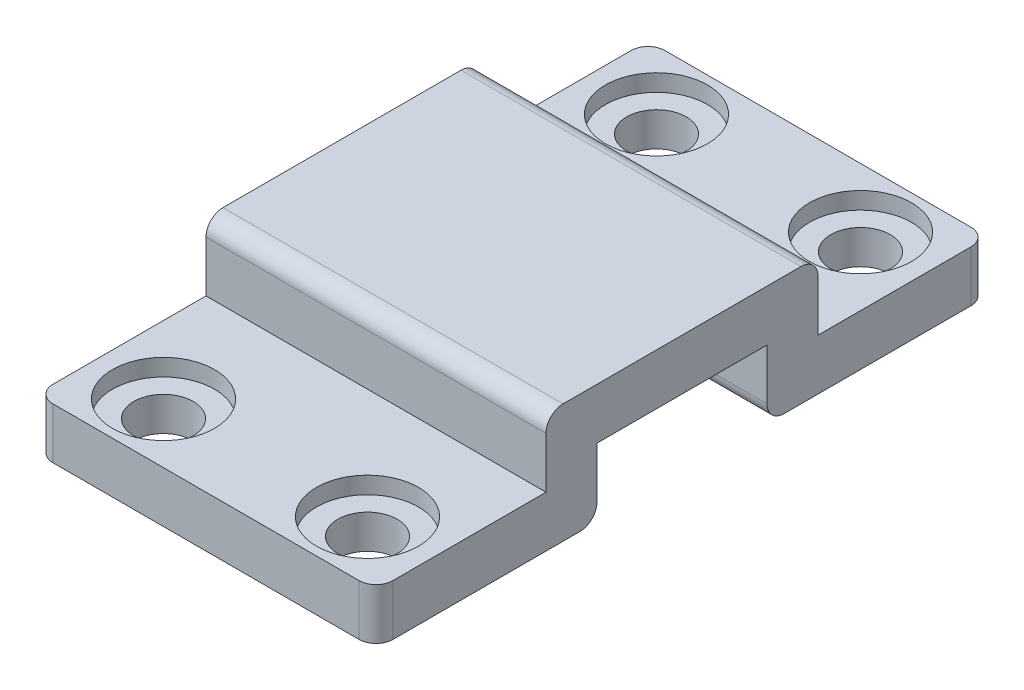
ISO-10303-21;
HEADER;
FILE_DESCRIPTION(('STEP AP214'),'2;1');
FILE_NAME('part.step','',(''),(''),'','','');
FILE_SCHEMA(('AUTOMOTIVE_DESIGN { 1 0 10303 214 1 1 1 1 }'));
ENDSEC;
DATA;
#1=APPLICATION_CONTEXT('core data for automotive mechanical design processes');
#2=APPLICATION_PROTOCOL_DEFINITION('international standard','automotive_design',2000,#1);
#3=PRODUCT_CONTEXT('',#1,'mechanical');
#4=PRODUCT('Part','Part','',(#3));
#5=PRODUCT_RELATED_PRODUCT_CATEGORY('part','',(#4));
#6=PRODUCT_DEFINITION_FORMATION('','',#4);
#7=PRODUCT_DEFINITION_CONTEXT('part definition',#1,'design');
#8=PRODUCT_DEFINITION('design','',#6,#7);
#9=PRODUCT_DEFINITION_SHAPE('','',#8);
#10=(LENGTH_UNIT() NAMED_UNIT(*) SI_UNIT(.MILLI.,.METRE.));
#11=(NAMED_UNIT(*) PLANE_ANGLE_UNIT() SI_UNIT($,.RADIAN.));
#12=(NAMED_UNIT(*) SI_UNIT($,.STERADIAN.) SOLID_ANGLE_UNIT());
#13=UNCERTAINTY_MEASURE_WITH_UNIT(LENGTH_MEASURE(1.E-05),#10,'distance_accuracy_value','');
#14=(GEOMETRIC_REPRESENTATION_CONTEXT(3) GLOBAL_UNCERTAINTY_ASSIGNED_CONTEXT((#13)) GLOBAL_UNIT_ASSIGNED_CONTEXT((#10,
#11,#12)) REPRESENTATION_CONTEXT('',''));
#15=CARTESIAN_POINT('',(0.,0.,0.));
#16=DIRECTION('',(0.,0.,1.));
#17=DIRECTION('',(1.,0.,0.));
#18=AXIS2_PLACEMENT_3D('',#15,#16,#17);
#19=CARTESIAN_POINT('',(6.00000000000001,-4.000025,14.5));
#20=DIRECTION('',(0.,1.,0.));
#21=DIRECTION('',(0.,0.,1.));
#22=AXIS2_PLACEMENT_3D('',#19,#20,#21);
#23=CYLINDRICAL_SURFACE('',#22,1.75);
#24=CARTESIAN_POINT('',(6.00000000000001,-4.,14.5));
#25=DIRECTION('',(0.,-1.,0.));
#26=DIRECTION('',(0.,0.,-1.));
#27=AXIS2_PLACEMENT_3D('',#24,#25,#26);
#28=CIRCLE('',#27,1.75);
#29=CARTESIAN_POINT('',(6.00000000000001,-4.,12.75));
#30=VERTEX_POINT('',#29);
#31=EDGE_CURVE('E668',#30,#30,#28,.T.);
#32=ORIENTED_EDGE('',*,*,#31,.T.);
#33=EDGE_LOOP('',(#32));
#34=FACE_BOUND('',#33,.T.);
#35=CARTESIAN_POINT('',(6.00000000000001,-2.,14.5));
#36=DIRECTION('',(0.,1.,0.));
#37=DIRECTION('',(0.,0.,1.));
#38=AXIS2_PLACEMENT_3D('',#35,#36,#37);
#39=CIRCLE('',#38,1.75);
#40=CARTESIAN_POINT('',(6.00000000000001,-2.,16.25));
#41=VERTEX_POINT('',#40);
#42=EDGE_CURVE('E703',#41,#41,#39,.T.);
#43=ORIENTED_EDGE('',*,*,#42,.T.);
#44=EDGE_LOOP('',(#43));
#45=FACE_BOUND('',#44,.T.);
#46=ADVANCED_FACE('F35',(#34,#45),#23,.F.);
#47=CARTESIAN_POINT('',(-6.,-4.000025,14.5));
#48=DIRECTION('',(0.,1.,0.));
#49=DIRECTION('',(0.,0.,1.));
#50=AXIS2_PLACEMENT_3D('',#47,#48,#49);
#51=CYLINDRICAL_SURFACE('',#50,1.75);
#52=CARTESIAN_POINT('',(-6.,-4.,14.5));
#53=DIRECTION('',(0.,-1.,0.));
#54=DIRECTION('',(0.,0.,-1.));
#55=AXIS2_PLACEMENT_3D('',#52,#53,#54);
#56=CIRCLE('',#55,1.75);
#57=CARTESIAN_POINT('',(-6.,-4.,12.75));
#58=VERTEX_POINT('',#57);
#59=EDGE_CURVE('E665',#58,#58,#56,.F.);
#60=ORIENTED_EDGE('',*,*,#59,.F.);
#61=EDGE_LOOP('',(#60));
#62=FACE_BOUND('',#61,.T.);
#63=CARTESIAN_POINT('',(-6.,-2.,14.5));
#64=DIRECTION('',(0.,1.,0.));
#65=DIRECTION('',(0.,0.,1.));
#66=AXIS2_PLACEMENT_3D('',#63,#64,#65);
#67=CIRCLE('',#66,1.75);
#68=CARTESIAN_POINT('',(-6.,-2.,16.25));
#69=VERTEX_POINT('',#68);
#70=EDGE_CURVE('E694',#69,#69,#67,.T.);
#71=ORIENTED_EDGE('',*,*,#70,.T.);
#72=EDGE_LOOP('',(#71));
#73=FACE_BOUND('',#72,.T.);
#74=ADVANCED_FACE('F427',(#62,#73),#51,.F.);
#75=CARTESIAN_POINT('',(6.,-4.000025,-14.5));
#76=DIRECTION('',(0.,1.,0.));
#77=DIRECTION('',(0.,0.,1.));
#78=AXIS2_PLACEMENT_3D('',#75,#76,#77);
#79=CYLINDRICAL_SURFACE('',#78,1.75);
#80=CARTESIAN_POINT('',(6.,-4.,-14.5));
#81=DIRECTION('',(0.,1.,0.));
#82=DIRECTION('',(0.,0.,1.));
#83=AXIS2_PLACEMENT_3D('',#80,#81,#82);
#84=CIRCLE('',#83,1.75);
#85=CARTESIAN_POINT('',(6.,-4.,-12.75));
#86=VERTEX_POINT('',#85);
#87=EDGE_CURVE('E209',#86,#86,#84,.F.);
#88=ORIENTED_EDGE('',*,*,#87,.T.);
#89=EDGE_LOOP('',(#88));
#90=FACE_BOUND('',#89,.T.);
#91=CARTESIAN_POINT('',(6.,-2.,-14.5));
#92=DIRECTION('',(0.,1.,0.));
#93=DIRECTION('',(0.,0.,1.));
#94=AXIS2_PLACEMENT_3D('',#91,#92,#93);
#95=CIRCLE('',#94,1.75);
#96=CARTESIAN_POINT('',(6.,-2.,-12.75));
#97=VERTEX_POINT('',#96);
#98=EDGE_CURVE('E685',#97,#97,#95,.F.);
#99=ORIENTED_EDGE('',*,*,#98,.F.);
#100=EDGE_LOOP('',(#99));
#101=FACE_BOUND('',#100,.T.);
#102=ADVANCED_FACE('F433',(#90,#101),#79,.F.);
#103=CARTESIAN_POINT('',(-6.,-4.000025,-14.5));
#104=DIRECTION('',(0.,1.,0.));
#105=DIRECTION('',(0.,0.,1.));
#106=AXIS2_PLACEMENT_3D('',#103,#104,#105);
#107=CYLINDRICAL_SURFACE('',#106,1.75);
#108=CARTESIAN_POINT('',(-6.,-4.,-14.5));
#109=DIRECTION('',(0.,1.,0.));
#110=DIRECTION('',(0.,0.,1.));
#111=AXIS2_PLACEMENT_3D('',#108,#109,#110);
#112=CIRCLE('',#111,1.75);
#113=CARTESIAN_POINT('',(-6.,-4.,-12.75));
#114=VERTEX_POINT('',#113);
#115=EDGE_CURVE('E204',#114,#114,#112,.T.);
#116=ORIENTED_EDGE('',*,*,#115,.F.);
#117=EDGE_LOOP('',(#116));
#118=FACE_BOUND('',#117,.T.);
#119=CARTESIAN_POINT('',(-6.,-2.,-14.5));
#120=DIRECTION('',(0.,1.,0.));
#121=DIRECTION('',(0.,0.,1.));
#122=AXIS2_PLACEMENT_3D('',#119,#120,#121);
#123=CIRCLE('',#122,1.75);
#124=CARTESIAN_POINT('',(-6.,-2.,-12.75));
#125=VERTEX_POINT('',#124);
#126=EDGE_CURVE('E676',#125,#125,#123,.F.);
#127=ORIENTED_EDGE('',*,*,#126,.F.);
#128=EDGE_LOOP('',(#127));
#129=FACE_BOUND('',#128,.T.);
#130=ADVANCED_FACE('F444',(#118,#129),#107,.F.);
#131=CARTESIAN_POINT('',(0.,-4.,0.));
#132=DIRECTION('',(0.,-1.,0.));
#133=DIRECTION('',(0.,0.,-1.));
#134=AXIS2_PLACEMENT_3D('',#131,#132,#133);
#135=PLANE('',#134);
#136=ORIENTED_EDGE('',*,*,#31,.F.);
#137=EDGE_LOOP('',(#136));
#138=FACE_BOUND('',#137,.T.);
#139=DIRECTION('',(0.,0.,-1.));
#140=VECTOR('',#139,1.);
#141=CARTESIAN_POINT('',(10.,-4.,8.));
#142=LINE('',#141,#140);
#143=CARTESIAN_POINT('',(10.,-4.,17.));
#144=VERTEX_POINT('',#143);
#145=CARTESIAN_POINT('',(10.,-4.,6.));
#146=VERTEX_POINT('',#145);
#147=EDGE_CURVE('E263',#144,#146,#142,.T.);
#148=ORIENTED_EDGE('',*,*,#147,.F.);
#149=CARTESIAN_POINT('',(9.,-4.,17.));
#150=DIRECTION('',(0.,-1.,0.));
#151=DIRECTION('',(0.,0.,-1.));
#152=AXIS2_PLACEMENT_3D('',#149,#150,#151);
#153=CIRCLE('',#152,1.);
#154=CARTESIAN_POINT('',(9.,-4.,18.));
#155=VERTEX_POINT('',#154);
#156=EDGE_CURVE('E273',#144,#155,#153,.T.);
#157=ORIENTED_EDGE('',*,*,#156,.T.);
#158=DIRECTION('',(1.,0.,0.));
#159=VECTOR('',#158,1.);
#160=CARTESIAN_POINT('',(-10.,-4.,18.));
#161=LINE('',#160,#159);
#162=CARTESIAN_POINT('',(-9.,-4.,18.));
#163=VERTEX_POINT('',#162);
#164=EDGE_CURVE('E223',#163,#155,#161,.T.);
#165=ORIENTED_EDGE('',*,*,#164,.F.);
#166=CARTESIAN_POINT('',(-9.,-4.,17.));
#167=DIRECTION('',(0.,-1.,0.));
#168=DIRECTION('',(0.,0.,-1.));
#169=AXIS2_PLACEMENT_3D('',#166,#167,#168);
#170=CIRCLE('',#169,1.);
#171=CARTESIAN_POINT('',(-10.,-4.,17.));
#172=VERTEX_POINT('',#171);
#173=EDGE_CURVE('E349',#163,#172,#170,.T.);
#174=ORIENTED_EDGE('',*,*,#173,.T.);
#175=DIRECTION('',(0.,0.,1.));
#176=VECTOR('',#175,1.);
#177=CARTESIAN_POINT('',(-10.,-4.,8.));
#178=LINE('',#177,#176);
#179=CARTESIAN_POINT('',(-10.,-4.,6.));
#180=VERTEX_POINT('',#179);
#181=EDGE_CURVE('E325',#180,#172,#178,.T.);
#182=ORIENTED_EDGE('',*,*,#181,.F.);
#183=DIRECTION('',(-1.,0.,0.));
#184=VECTOR('',#183,1.);
#185=CARTESIAN_POINT('',(0.,-4.,6.));
#186=LINE('',#185,#184);
#187=EDGE_CURVE('E348',#180,#146,#186,.F.);
#188=ORIENTED_EDGE('',*,*,#187,.T.);
#189=EDGE_LOOP('',(#148,#157,#165,#174,#182,#188));
#190=FACE_BOUND('',#189,.T.);
#191=ORIENTED_EDGE('',*,*,#59,.T.);
#192=EDGE_LOOP('',(#191));
#193=FACE_BOUND('',#192,.T.);
#194=ADVANCED_FACE('F354',(#138,#190,#193),#135,.T.);
#195=CARTESIAN_POINT('',(-10.,-1.,18.));
#196=DIRECTION('',(0.,-1.,0.));
#197=DIRECTION('',(0.,0.,-1.));
#198=AXIS2_PLACEMENT_3D('',#195,#196,#197);
#199=PLANE('',#198);
#200=CARTESIAN_POINT('',(6.00000000000001,-1.,14.5));
#201=DIRECTION('',(0.,1.,0.));
#202=DIRECTION('',(0.,0.,1.));
#203=AXIS2_PLACEMENT_3D('',#200,#201,#202);
#204=CIRCLE('',#203,3.);
#205=CARTESIAN_POINT('',(6.00000000000001,-1.,17.5));
#206=VERTEX_POINT('',#205);
#207=EDGE_CURVE('E700',#206,#206,#204,.T.);
#208=ORIENTED_EDGE('',*,*,#207,.F.);
#209=EDGE_LOOP('',(#208));
#210=FACE_BOUND('',#209,.T.);
#211=CARTESIAN_POINT('',(-6.,-1.,14.5));
#212=DIRECTION('',(0.,1.,0.));
#213=DIRECTION('',(0.,0.,1.));
#214=AXIS2_PLACEMENT_3D('',#211,#212,#213);
#215=CIRCLE('',#214,3.);
#216=CARTESIAN_POINT('',(-6.,-1.,17.5));
#217=VERTEX_POINT('',#216);
#218=EDGE_CURVE('E691',#217,#217,#215,.T.);
#219=ORIENTED_EDGE('',*,*,#218,.F.);
#220=EDGE_LOOP('',(#219));
#221=FACE_BOUND('',#220,.T.);
#222=DIRECTION('',(-1.,0.,0.));
#223=VECTOR('',#222,1.);
#224=CARTESIAN_POINT('',(-10.,-1.,18.));
#225=LINE('',#224,#223);
#226=CARTESIAN_POINT('',(9.,-1.,18.));
#227=VERTEX_POINT('',#226);
#228=CARTESIAN_POINT('',(-9.,-1.,18.));
#229=VERTEX_POINT('',#228);
#230=EDGE_CURVE('E220',#227,#229,#225,.T.);
#231=ORIENTED_EDGE('',*,*,#230,.F.);
#232=CARTESIAN_POINT('',(9.,-1.,17.));
#233=DIRECTION('',(0.,-1.,0.));
#234=DIRECTION('',(0.,0.,-1.));
#235=AXIS2_PLACEMENT_3D('',#232,#233,#234);
#236=CIRCLE('',#235,1.);
#237=CARTESIAN_POINT('',(10.,-1.,17.));
#238=VERTEX_POINT('',#237);
#239=EDGE_CURVE('E251',#227,#238,#236,.F.);
#240=ORIENTED_EDGE('',*,*,#239,.T.);
#241=DIRECTION('',(0.,0.,-1.));
#242=VECTOR('',#241,1.);
#243=CARTESIAN_POINT('',(10.,-1.,18.));
#244=LINE('',#243,#242);
#245=CARTESIAN_POINT('',(10.,-1.,8.));
#246=VERTEX_POINT('',#245);
#247=EDGE_CURVE('E245',#238,#246,#244,.T.);
#248=ORIENTED_EDGE('',*,*,#247,.T.);
#249=DIRECTION('',(-1.,0.,0.));
#250=VECTOR('',#249,1.);
#251=CARTESIAN_POINT('',(-10.,-1.,8.));
#252=LINE('',#251,#250);
#253=CARTESIAN_POINT('',(-10.,-1.,8.));
#254=VERTEX_POINT('',#253);
#255=EDGE_CURVE('E224',#246,#254,#252,.T.);
#256=ORIENTED_EDGE('',*,*,#255,.T.);
#257=DIRECTION('',(0.,0.,-1.));
#258=VECTOR('',#257,1.);
#259=CARTESIAN_POINT('',(-10.,-1.,18.));
#260=LINE('',#259,#258);
#261=CARTESIAN_POINT('',(-10.,-1.,17.));
#262=VERTEX_POINT('',#261);
#263=EDGE_CURVE('E227',#262,#254,#260,.T.);
#264=ORIENTED_EDGE('',*,*,#263,.F.);
#265=CARTESIAN_POINT('',(-9.,-1.,17.));
#266=DIRECTION('',(0.,-1.,0.));
#267=DIRECTION('',(0.,0.,-1.));
#268=AXIS2_PLACEMENT_3D('',#265,#266,#267);
#269=CIRCLE('',#268,1.);
#270=EDGE_CURVE('E249',#262,#229,#269,.F.);
#271=ORIENTED_EDGE('',*,*,#270,.T.);
#272=EDGE_LOOP('',(#231,#240,#248,#256,#264,#271));
#273=FACE_BOUND('',#272,.T.);
#274=ADVANCED_FACE('F406',(#210,#221,#273),#199,.F.);
#275=CARTESIAN_POINT('',(0.,-4.,0.));
#276=DIRECTION('',(0.,1.,0.));
#277=DIRECTION('',(0.,0.,1.));
#278=AXIS2_PLACEMENT_3D('',#275,#276,#277);
#279=PLANE('',#278);
#280=DIRECTION('',(0.,0.,1.));
#281=VECTOR('',#280,1.);
#282=CARTESIAN_POINT('',(-10.,-4.,-8.));
#283=LINE('',#282,#281);
#284=CARTESIAN_POINT('',(-10.,-4.,-17.));
#285=VERTEX_POINT('',#284);
#286=CARTESIAN_POINT('',(-10.,-4.,-6.));
#287=VERTEX_POINT('',#286);
#288=EDGE_CURVE('E230',#285,#287,#283,.T.);
#289=ORIENTED_EDGE('',*,*,#288,.F.);
#290=CARTESIAN_POINT('',(-9.,-4.,-17.));
#291=DIRECTION('',(0.,1.,0.));
#292=DIRECTION('',(0.,0.,1.));
#293=AXIS2_PLACEMENT_3D('',#290,#291,#292);
#294=CIRCLE('',#293,1.);
#295=CARTESIAN_POINT('',(-9.,-4.,-18.));
#296=VERTEX_POINT('',#295);
#297=EDGE_CURVE('E50',#285,#296,#294,.F.);
#298=ORIENTED_EDGE('',*,*,#297,.T.);
#299=DIRECTION('',(-1.,0.,0.));
#300=VECTOR('',#299,1.);
#301=CARTESIAN_POINT('',(10.,-4.,-18.));
#302=LINE('',#301,#300);
#303=CARTESIAN_POINT('',(9.,-4.,-18.));
#304=VERTEX_POINT('',#303);
#305=EDGE_CURVE('E187',#304,#296,#302,.T.);
#306=ORIENTED_EDGE('',*,*,#305,.F.);
#307=CARTESIAN_POINT('',(9.,-4.,-17.));
#308=DIRECTION('',(0.,1.,0.));
#309=DIRECTION('',(0.,0.,1.));
#310=AXIS2_PLACEMENT_3D('',#307,#308,#309);
#311=CIRCLE('',#310,1.);
#312=CARTESIAN_POINT('',(10.,-4.,-17.));
#313=VERTEX_POINT('',#312);
#314=EDGE_CURVE('E58',#304,#313,#311,.F.);
#315=ORIENTED_EDGE('',*,*,#314,.T.);
#316=DIRECTION('',(0.,0.,-1.));
#317=VECTOR('',#316,1.);
#318=CARTESIAN_POINT('',(10.,-4.,-8.));
#319=LINE('',#318,#317);
#320=CARTESIAN_POINT('',(10.,-4.,-6.));
#321=VERTEX_POINT('',#320);
#322=EDGE_CURVE('E268',#321,#313,#319,.T.);
#323=ORIENTED_EDGE('',*,*,#322,.F.);
#324=DIRECTION('',(1.,0.,0.));
#325=VECTOR('',#324,1.);
#326=CARTESIAN_POINT('',(-10.,-4.,-6.));
#327=LINE('',#326,#325);
#328=EDGE_CURVE('E292',#321,#287,#327,.F.);
#329=ORIENTED_EDGE('',*,*,#328,.T.);
#330=EDGE_LOOP('',(#289,#298,#306,#315,#323,#329));
#331=FACE_BOUND('',#330,.T.);
#332=ORIENTED_EDGE('',*,*,#115,.T.);
#333=EDGE_LOOP('',(#332));
#334=FACE_BOUND('',#333,.T.);
#335=ORIENTED_EDGE('',*,*,#87,.F.);
#336=EDGE_LOOP('',(#335));
#337=FACE_BOUND('',#336,.T.);
#338=ADVANCED_FACE('F455',(#331,#334,#337),#279,.F.);
#339=CARTESIAN_POINT('',(10.,-1.,-18.));
#340=DIRECTION('',(0.,-1.,0.));
#341=DIRECTION('',(0.,0.,-1.));
#342=AXIS2_PLACEMENT_3D('',#339,#340,#341);
#343=PLANE('',#342);
#344=CARTESIAN_POINT('',(6.,-1.,-14.5));
#345=DIRECTION('',(0.,1.,0.));
#346=DIRECTION('',(0.,0.,1.));
#347=AXIS2_PLACEMENT_3D('',#344,#345,#346);
#348=CIRCLE('',#347,3.);
#349=CARTESIAN_POINT('',(6.,-1.,-11.5));
#350=VERTEX_POINT('',#349);
#351=EDGE_CURVE('E682',#350,#350,#348,.T.);
#352=ORIENTED_EDGE('',*,*,#351,.F.);
#353=EDGE_LOOP('',(#352));
#354=FACE_BOUND('',#353,.T.);
#355=CARTESIAN_POINT('',(-6.,-1.,-14.5));
#356=DIRECTION('',(0.,1.,0.));
#357=DIRECTION('',(0.,0.,1.));
#358=AXIS2_PLACEMENT_3D('',#355,#356,#357);
#359=CIRCLE('',#358,3.);
#360=CARTESIAN_POINT('',(-6.,-1.,-11.5));
#361=VERTEX_POINT('',#360);
#362=EDGE_CURVE('E673',#361,#361,#359,.T.);
#363=ORIENTED_EDGE('',*,*,#362,.F.);
#364=EDGE_LOOP('',(#363));
#365=FACE_BOUND('',#364,.T.);
#366=DIRECTION('',(1.,0.,0.));
#367=VECTOR('',#366,1.);
#368=CARTESIAN_POINT('',(10.,-1.,-18.));
#369=LINE('',#368,#367);
#370=CARTESIAN_POINT('',(-9.,-1.,-18.));
#371=VERTEX_POINT('',#370);
#372=CARTESIAN_POINT('',(9.,-1.,-18.));
#373=VERTEX_POINT('',#372);
#374=EDGE_CURVE('E203',#371,#373,#369,.T.);
#375=ORIENTED_EDGE('',*,*,#374,.F.);
#376=CARTESIAN_POINT('',(-9.,-1.,-17.));
#377=DIRECTION('',(0.,-1.,0.));
#378=DIRECTION('',(0.,0.,-1.));
#379=AXIS2_PLACEMENT_3D('',#376,#377,#378);
#380=CIRCLE('',#379,1.);
#381=CARTESIAN_POINT('',(-10.,-1.,-17.));
#382=VERTEX_POINT('',#381);
#383=EDGE_CURVE('E290',#371,#382,#380,.F.);
#384=ORIENTED_EDGE('',*,*,#383,.T.);
#385=DIRECTION('',(0.,0.,1.));
#386=VECTOR('',#385,1.);
#387=CARTESIAN_POINT('',(-10.,-1.,-18.));
#388=LINE('',#387,#386);
#389=CARTESIAN_POINT('',(-10.,-1.,-8.));
#390=VERTEX_POINT('',#389);
#391=EDGE_CURVE('E186',#382,#390,#388,.T.);
#392=ORIENTED_EDGE('',*,*,#391,.T.);
#393=DIRECTION('',(1.,0.,0.));
#394=VECTOR('',#393,1.);
#395=CARTESIAN_POINT('',(10.,-1.,-8.));
#396=LINE('',#395,#394);
#397=CARTESIAN_POINT('',(10.,-1.,-8.));
#398=VERTEX_POINT('',#397);
#399=EDGE_CURVE('E193',#390,#398,#396,.T.);
#400=ORIENTED_EDGE('',*,*,#399,.T.);
#401=DIRECTION('',(0.,0.,1.));
#402=VECTOR('',#401,1.);
#403=CARTESIAN_POINT('',(10.,-1.,-18.));
#404=LINE('',#403,#402);
#405=CARTESIAN_POINT('',(10.,-1.,-17.));
#406=VERTEX_POINT('',#405);
#407=EDGE_CURVE('E175',#406,#398,#404,.T.);
#408=ORIENTED_EDGE('',*,*,#407,.F.);
#409=CARTESIAN_POINT('',(9.,-1.,-17.));
#410=DIRECTION('',(0.,-1.,0.));
#411=DIRECTION('',(0.,0.,-1.));
#412=AXIS2_PLACEMENT_3D('',#409,#410,#411);
#413=CIRCLE('',#412,1.);
#414=EDGE_CURVE('E288',#406,#373,#413,.F.);
#415=ORIENTED_EDGE('',*,*,#414,.T.);
#416=EDGE_LOOP('',(#375,#384,#392,#400,#408,#415));
#417=FACE_BOUND('',#416,.T.);
#418=ADVANCED_FACE('F201',(#354,#365,#417),#343,.F.);
#419=CARTESIAN_POINT('',(10.,3.,5.));
#420=DIRECTION('',(-1.,0.,0.));
#421=DIRECTION('',(0.,0.,1.));
#422=AXIS2_PLACEMENT_3D('',#419,#420,#421);
#423=PLANE('',#422);
#424=ORIENTED_EDGE('',*,*,#247,.F.);
#425=DIRECTION('',(0.,1.,0.));
#426=VECTOR('',#425,1.);
#427=CARTESIAN_POINT('',(10.,-4.,17.));
#428=LINE('',#427,#426);
#429=EDGE_CURVE('E346',#238,#144,#428,.F.);
#430=ORIENTED_EDGE('',*,*,#429,.T.);
#431=ORIENTED_EDGE('',*,*,#147,.T.);
#432=CARTESIAN_POINT('',(10.,-3.,6.));
#433=DIRECTION('',(-1.,0.,0.));
#434=DIRECTION('',(0.,0.,1.));
#435=AXIS2_PLACEMENT_3D('',#432,#433,#434);
#436=CIRCLE('',#435,1.);
#437=CARTESIAN_POINT('',(10.,-3.,5.));
#438=VERTEX_POINT('',#437);
#439=EDGE_CURVE('E339',#146,#438,#436,.F.);
#440=ORIENTED_EDGE('',*,*,#439,.T.);
#441=DIRECTION('',(0.,1.,0.));
#442=VECTOR('',#441,1.);
#443=CARTESIAN_POINT('',(10.,-4.,5.));
#444=LINE('',#443,#442);
#445=CARTESIAN_POINT('',(10.,0.,5.));
#446=VERTEX_POINT('',#445);
#447=EDGE_CURVE('E313',#438,#446,#444,.T.);
#448=ORIENTED_EDGE('',*,*,#447,.T.);
#449=DIRECTION('',(0.,0.,-1.));
#450=VECTOR('',#449,1.);
#451=CARTESIAN_POINT('',(10.,0.,5.));
#452=LINE('',#451,#450);
#453=CARTESIAN_POINT('',(10.,0.,-5.));
#454=VERTEX_POINT('',#453);
#455=EDGE_CURVE('E385',#446,#454,#452,.T.);
#456=ORIENTED_EDGE('',*,*,#455,.T.);
#457=DIRECTION('',(0.,1.,0.));
#458=VECTOR('',#457,1.);
#459=CARTESIAN_POINT('',(10.,-4.,-5.));
#460=LINE('',#459,#458);
#461=CARTESIAN_POINT('',(10.,-3.,-5.));
#462=VERTEX_POINT('',#461);
#463=EDGE_CURVE('E198',#462,#454,#460,.T.);
#464=ORIENTED_EDGE('',*,*,#463,.F.);
#465=CARTESIAN_POINT('',(10.,-3.,-6.));
#466=DIRECTION('',(-1.,0.,0.));
#467=DIRECTION('',(0.,0.,1.));
#468=AXIS2_PLACEMENT_3D('',#465,#466,#467);
#469=CIRCLE('',#468,1.);
#470=EDGE_CURVE('E253',#462,#321,#469,.F.);
#471=ORIENTED_EDGE('',*,*,#470,.T.);
#472=ORIENTED_EDGE('',*,*,#322,.T.);
#473=DIRECTION('',(0.,-1.,0.));
#474=VECTOR('',#473,1.);
#475=CARTESIAN_POINT('',(10.,-1.,-17.));
#476=LINE('',#475,#474);
#477=EDGE_CURVE('E182',#313,#406,#476,.F.);
#478=ORIENTED_EDGE('',*,*,#477,.T.);
#479=ORIENTED_EDGE('',*,*,#407,.T.);
#480=DIRECTION('',(0.,1.,0.));
#481=VECTOR('',#480,1.);
#482=CARTESIAN_POINT('',(10.,-4.,-8.));
#483=LINE('',#482,#481);
#484=CARTESIAN_POINT('',(10.,2.,-8.));
#485=VERTEX_POINT('',#484);
#486=EDGE_CURVE('E179',#398,#485,#483,.T.);
#487=ORIENTED_EDGE('',*,*,#486,.T.);
#488=CARTESIAN_POINT('',(10.,2.,-7.));
#489=DIRECTION('',(-1.,0.,0.));
#490=DIRECTION('',(0.,0.,1.));
#491=AXIS2_PLACEMENT_3D('',#488,#489,#490);
#492=CIRCLE('',#491,1.);
#493=CARTESIAN_POINT('',(10.,3.,-7.));
#494=VERTEX_POINT('',#493);
#495=EDGE_CURVE('E341',#485,#494,#492,.F.);
#496=ORIENTED_EDGE('',*,*,#495,.T.);
#497=DIRECTION('',(0.,0.,-1.));
#498=VECTOR('',#497,1.);
#499=CARTESIAN_POINT('',(10.,3.,5.));
#500=LINE('',#499,#498);
#501=CARTESIAN_POINT('',(10.,3.,7.));
#502=VERTEX_POINT('',#501);
#503=EDGE_CURVE('E335',#502,#494,#500,.T.);
#504=ORIENTED_EDGE('',*,*,#503,.F.);
#505=CARTESIAN_POINT('',(10.,2.,7.));
#506=DIRECTION('',(-1.,0.,0.));
#507=DIRECTION('',(0.,0.,1.));
#508=AXIS2_PLACEMENT_3D('',#505,#506,#507);
#509=CIRCLE('',#508,1.);
#510=CARTESIAN_POINT('',(10.,2.,8.));
#511=VERTEX_POINT('',#510);
#512=EDGE_CURVE('E343',#502,#511,#509,.F.);
#513=ORIENTED_EDGE('',*,*,#512,.T.);
#514=DIRECTION('',(0.,1.,0.));
#515=VECTOR('',#514,1.);
#516=CARTESIAN_POINT('',(10.,-4.,8.));
#517=LINE('',#516,#515);
#518=EDGE_CURVE('E236',#246,#511,#517,.T.);
#519=ORIENTED_EDGE('',*,*,#518,.F.);
#520=EDGE_LOOP('',(#424,#430,#431,#440,#448,#456,#464,#471,#472,#478,#479,#487,#496,#504,#513,#519));
#521=FACE_BOUND('',#520,.T.);
#522=ADVANCED_FACE('F178',(#521),#423,.F.);
#523=CARTESIAN_POINT('',(-10.,3.,5.));
#524=DIRECTION('',(1.,0.,0.));
#525=DIRECTION('',(0.,0.,-1.));
#526=AXIS2_PLACEMENT_3D('',#523,#524,#525);
#527=PLANE('',#526);
#528=ORIENTED_EDGE('',*,*,#181,.T.);
#529=DIRECTION('',(0.,-1.,0.));
#530=VECTOR('',#529,1.);
#531=CARTESIAN_POINT('',(-10.,-1.,17.));
#532=LINE('',#531,#530);
#533=EDGE_CURVE('E281',#172,#262,#532,.F.);
#534=ORIENTED_EDGE('',*,*,#533,.T.);
#535=ORIENTED_EDGE('',*,*,#263,.T.);
#536=DIRECTION('',(0.,1.,0.));
#537=VECTOR('',#536,1.);
#538=CARTESIAN_POINT('',(-10.,-4.,8.));
#539=LINE('',#538,#537);
#540=CARTESIAN_POINT('',(-10.,2.,8.));
#541=VERTEX_POINT('',#540);
#542=EDGE_CURVE('E323',#254,#541,#539,.T.);
#543=ORIENTED_EDGE('',*,*,#542,.T.);
#544=CARTESIAN_POINT('',(-10.,2.,7.));
#545=DIRECTION('',(1.,0.,0.));
#546=DIRECTION('',(0.,0.,-1.));
#547=AXIS2_PLACEMENT_3D('',#544,#545,#546);
#548=CIRCLE('',#547,1.);
#549=CARTESIAN_POINT('',(-10.,3.,7.));
#550=VERTEX_POINT('',#549);
#551=EDGE_CURVE('E277',#541,#550,#548,.F.);
#552=ORIENTED_EDGE('',*,*,#551,.T.);
#553=DIRECTION('',(0.,0.,1.));
#554=VECTOR('',#553,1.);
#555=CARTESIAN_POINT('',(-10.,3.,5.));
#556=LINE('',#555,#554);
#557=CARTESIAN_POINT('',(-10.,3.,-7.));
#558=VERTEX_POINT('',#557);
#559=EDGE_CURVE('E368',#558,#550,#556,.T.);
#560=ORIENTED_EDGE('',*,*,#559,.F.);
#561=CARTESIAN_POINT('',(-10.,2.,-7.));
#562=DIRECTION('',(1.,0.,0.));
#563=DIRECTION('',(0.,0.,-1.));
#564=AXIS2_PLACEMENT_3D('',#561,#562,#563);
#565=CIRCLE('',#564,1.);
#566=CARTESIAN_POINT('',(-10.,2.,-8.));
#567=VERTEX_POINT('',#566);
#568=EDGE_CURVE('E275',#558,#567,#565,.F.);
#569=ORIENTED_EDGE('',*,*,#568,.T.);
#570=DIRECTION('',(0.,1.,0.));
#571=VECTOR('',#570,1.);
#572=CARTESIAN_POINT('',(-10.,-4.,-8.));
#573=LINE('',#572,#571);
#574=EDGE_CURVE('E197',#390,#567,#573,.T.);
#575=ORIENTED_EDGE('',*,*,#574,.F.);
#576=ORIENTED_EDGE('',*,*,#391,.F.);
#577=DIRECTION('',(0.,1.,0.));
#578=VECTOR('',#577,1.);
#579=CARTESIAN_POINT('',(-10.,-4.,-17.));
#580=LINE('',#579,#578);
#581=EDGE_CURVE('E279',#382,#285,#580,.F.);
#582=ORIENTED_EDGE('',*,*,#581,.T.);
#583=ORIENTED_EDGE('',*,*,#288,.T.);
#584=CARTESIAN_POINT('',(-10.,-3.,-6.));
#585=DIRECTION('',(1.,0.,0.));
#586=DIRECTION('',(0.,0.,-1.));
#587=AXIS2_PLACEMENT_3D('',#584,#585,#586);
#588=CIRCLE('',#587,1.);
#589=CARTESIAN_POINT('',(-10.,-3.,-5.));
#590=VERTEX_POINT('',#589);
#591=EDGE_CURVE('E270',#287,#590,#588,.F.);
#592=ORIENTED_EDGE('',*,*,#591,.T.);
#593=DIRECTION('',(0.,1.,0.));
#594=VECTOR('',#593,1.);
#595=CARTESIAN_POINT('',(-10.,-4.,-5.));
#596=LINE('',#595,#594);
#597=CARTESIAN_POINT('',(-10.,0.,-5.));
#598=VERTEX_POINT('',#597);
#599=EDGE_CURVE('E255',#590,#598,#596,.T.);
#600=ORIENTED_EDGE('',*,*,#599,.T.);
#601=DIRECTION('',(0.,0.,1.));
#602=VECTOR('',#601,1.);
#603=CARTESIAN_POINT('',(-10.,0.,5.));
#604=LINE('',#603,#602);
#605=CARTESIAN_POINT('',(-10.,0.,5.));
#606=VERTEX_POINT('',#605);
#607=EDGE_CURVE('E321',#598,#606,#604,.T.);
#608=ORIENTED_EDGE('',*,*,#607,.T.);
#609=DIRECTION('',(0.,1.,0.));
#610=VECTOR('',#609,1.);
#611=CARTESIAN_POINT('',(-10.,-4.,5.));
#612=LINE('',#611,#610);
#613=CARTESIAN_POINT('',(-10.,-3.,5.));
#614=VERTEX_POINT('',#613);
#615=EDGE_CURVE('E311',#614,#606,#612,.T.);
#616=ORIENTED_EDGE('',*,*,#615,.F.);
#617=CARTESIAN_POINT('',(-10.,-3.,6.));
#618=DIRECTION('',(1.,0.,0.));
#619=DIRECTION('',(0.,0.,-1.));
#620=AXIS2_PLACEMENT_3D('',#617,#618,#619);
#621=CIRCLE('',#620,1.);
#622=EDGE_CURVE('E272',#614,#180,#621,.F.);
#623=ORIENTED_EDGE('',*,*,#622,.T.);
#624=EDGE_LOOP('',(#528,#534,#535,#543,#552,#560,#569,#575,#576,#582,#583,#592,#600,#608,#616,#623));
#625=FACE_BOUND('',#624,.T.);
#626=ADVANCED_FACE('F318',(#625),#527,.F.);
#627=CARTESIAN_POINT('',(0.,3.,0.));
#628=DIRECTION('',(0.,-1.,0.));
#629=DIRECTION('',(0.,0.,-1.));
#630=AXIS2_PLACEMENT_3D('',#627,#628,#629);
#631=PLANE('',#630);
#632=ORIENTED_EDGE('',*,*,#559,.T.);
#633=DIRECTION('',(1.,0.,0.));
#634=VECTOR('',#633,1.);
#635=CARTESIAN_POINT('',(10.,3.,7.));
#636=LINE('',#635,#634);
#637=EDGE_CURVE('E299',#550,#502,#636,.T.);
#638=ORIENTED_EDGE('',*,*,#637,.T.);
#639=ORIENTED_EDGE('',*,*,#503,.T.);
#640=DIRECTION('',(-1.,0.,0.));
#641=VECTOR('',#640,1.);
#642=CARTESIAN_POINT('',(-10.,3.,-7.));
#643=LINE('',#642,#641);
#644=EDGE_CURVE('E296',#494,#558,#643,.T.);
#645=ORIENTED_EDGE('',*,*,#644,.T.);
#646=EDGE_LOOP('',(#632,#638,#639,#645));
#647=FACE_BOUND('',#646,.T.);
#648=ADVANCED_FACE('F478',(#647),#631,.F.);
#649=CARTESIAN_POINT('',(0.,0.,0.));
#650=DIRECTION('',(0.,-1.,0.));
#651=DIRECTION('',(0.,0.,-1.));
#652=AXIS2_PLACEMENT_3D('',#649,#650,#651);
#653=PLANE('',#652);
#654=ORIENTED_EDGE('',*,*,#455,.F.);
#655=DIRECTION('',(1.,0.,0.));
#656=VECTOR('',#655,1.);
#657=CARTESIAN_POINT('',(-10.,0.,5.));
#658=LINE('',#657,#656);
#659=EDGE_CURVE('E375',#606,#446,#658,.T.);
#660=ORIENTED_EDGE('',*,*,#659,.F.);
#661=ORIENTED_EDGE('',*,*,#607,.F.);
#662=DIRECTION('',(-1.,0.,0.));
#663=VECTOR('',#662,1.);
#664=CARTESIAN_POINT('',(-10.,0.,-5.));
#665=LINE('',#664,#663);
#666=EDGE_CURVE('E382',#454,#598,#665,.T.);
#667=ORIENTED_EDGE('',*,*,#666,.F.);
#668=EDGE_LOOP('',(#654,#660,#661,#667));
#669=FACE_BOUND('',#668,.T.);
#670=ADVANCED_FACE('F475',(#669),#653,.T.);
#671=CARTESIAN_POINT('',(-10.,-4.,8.));
#672=DIRECTION('',(0.,0.,1.));
#673=DIRECTION('',(1.,0.,0.));
#674=AXIS2_PLACEMENT_3D('',#671,#672,#673);
#675=PLANE('',#674);
#676=ORIENTED_EDGE('',*,*,#518,.T.);
#677=DIRECTION('',(1.,0.,0.));
#678=VECTOR('',#677,1.);
#679=CARTESIAN_POINT('',(-10.,2.,8.));
#680=LINE('',#679,#678);
#681=EDGE_CURVE('E302',#511,#541,#680,.F.);
#682=ORIENTED_EDGE('',*,*,#681,.T.);
#683=ORIENTED_EDGE('',*,*,#542,.F.);
#684=ORIENTED_EDGE('',*,*,#255,.F.);
#685=EDGE_LOOP('',(#676,#682,#683,#684));
#686=FACE_BOUND('',#685,.T.);
#687=ADVANCED_FACE('F399',(#686),#675,.T.);
#688=CARTESIAN_POINT('',(-10.,-4.,5.));
#689=DIRECTION('',(0.,0.,-1.));
#690=DIRECTION('',(-1.,0.,0.));
#691=AXIS2_PLACEMENT_3D('',#688,#689,#690);
#692=PLANE('',#691);
#693=ORIENTED_EDGE('',*,*,#447,.F.);
#694=DIRECTION('',(-1.,0.,0.));
#695=VECTOR('',#694,1.);
#696=CARTESIAN_POINT('',(-10.,-3.,5.));
#697=LINE('',#696,#695);
#698=EDGE_CURVE('E43',#438,#614,#697,.T.);
#699=ORIENTED_EDGE('',*,*,#698,.T.);
#700=ORIENTED_EDGE('',*,*,#615,.T.);
#701=ORIENTED_EDGE('',*,*,#659,.T.);
#702=EDGE_LOOP('',(#693,#699,#700,#701));
#703=FACE_BOUND('',#702,.T.);
#704=ADVANCED_FACE('F309',(#703),#692,.T.);
#705=CARTESIAN_POINT('',(-10.,-4.,-8.));
#706=DIRECTION('',(0.,0.,-1.));
#707=DIRECTION('',(-1.,0.,0.));
#708=AXIS2_PLACEMENT_3D('',#705,#706,#707);
#709=PLANE('',#708);
#710=ORIENTED_EDGE('',*,*,#574,.T.);
#711=DIRECTION('',(-1.,0.,0.));
#712=VECTOR('',#711,1.);
#713=CARTESIAN_POINT('',(10.,2.,-8.));
#714=LINE('',#713,#712);
#715=EDGE_CURVE('E196',#567,#485,#714,.F.);
#716=ORIENTED_EDGE('',*,*,#715,.T.);
#717=ORIENTED_EDGE('',*,*,#486,.F.);
#718=ORIENTED_EDGE('',*,*,#399,.F.);
#719=EDGE_LOOP('',(#710,#716,#717,#718));
#720=FACE_BOUND('',#719,.T.);
#721=ADVANCED_FACE('F192',(#720),#709,.T.);
#722=CARTESIAN_POINT('',(-10.,-4.,-5.));
#723=DIRECTION('',(0.,0.,1.));
#724=DIRECTION('',(1.,0.,0.));
#725=AXIS2_PLACEMENT_3D('',#722,#723,#724);
#726=PLANE('',#725);
#727=ORIENTED_EDGE('',*,*,#599,.F.);
#728=DIRECTION('',(1.,0.,0.));
#729=VECTOR('',#728,1.);
#730=CARTESIAN_POINT('',(10.,-3.,-5.));
#731=LINE('',#730,#729);
#732=EDGE_CURVE('E11',#590,#462,#731,.T.);
#733=ORIENTED_EDGE('',*,*,#732,.T.);
#734=ORIENTED_EDGE('',*,*,#463,.T.);
#735=ORIENTED_EDGE('',*,*,#666,.T.);
#736=EDGE_LOOP('',(#727,#733,#734,#735));
#737=FACE_BOUND('',#736,.T.);
#738=ADVANCED_FACE('F459',(#737),#726,.T.);
#739=CARTESIAN_POINT('',(0.,0.,18.));
#740=DIRECTION('',(0.,0.,1.));
#741=DIRECTION('',(1.,0.,0.));
#742=AXIS2_PLACEMENT_3D('',#739,#740,#741);
#743=PLANE('',#742);
#744=ORIENTED_EDGE('',*,*,#164,.T.);
#745=DIRECTION('',(0.,1.,0.));
#746=VECTOR('',#745,1.);
#747=CARTESIAN_POINT('',(9.,-1.,18.));
#748=LINE('',#747,#746);
#749=EDGE_CURVE('E246',#155,#227,#748,.T.);
#750=ORIENTED_EDGE('',*,*,#749,.T.);
#751=ORIENTED_EDGE('',*,*,#230,.T.);
#752=DIRECTION('',(0.,-1.,0.));
#753=VECTOR('',#752,1.);
#754=CARTESIAN_POINT('',(-9.,-4.,18.));
#755=LINE('',#754,#753);
#756=EDGE_CURVE('E366',#229,#163,#755,.T.);
#757=ORIENTED_EDGE('',*,*,#756,.T.);
#758=EDGE_LOOP('',(#744,#750,#751,#757));
#759=FACE_BOUND('',#758,.T.);
#760=ADVANCED_FACE('F363',(#759),#743,.T.);
#761=CARTESIAN_POINT('',(0.,0.,-18.));
#762=DIRECTION('',(0.,0.,-1.));
#763=DIRECTION('',(-1.,0.,0.));
#764=AXIS2_PLACEMENT_3D('',#761,#762,#763);
#765=PLANE('',#764);
#766=ORIENTED_EDGE('',*,*,#305,.T.);
#767=DIRECTION('',(0.,1.,0.));
#768=VECTOR('',#767,1.);
#769=CARTESIAN_POINT('',(-9.,-1.,-18.));
#770=LINE('',#769,#768);
#771=EDGE_CURVE('E285',#296,#371,#770,.T.);
#772=ORIENTED_EDGE('',*,*,#771,.T.);
#773=ORIENTED_EDGE('',*,*,#374,.T.);
#774=DIRECTION('',(0.,-1.,0.));
#775=VECTOR('',#774,1.);
#776=CARTESIAN_POINT('',(9.,-4.,-18.));
#777=LINE('',#776,#775);
#778=EDGE_CURVE('E283',#373,#304,#777,.T.);
#779=ORIENTED_EDGE('',*,*,#778,.T.);
#780=EDGE_LOOP('',(#766,#772,#773,#779));
#781=FACE_BOUND('',#780,.T.);
#782=ADVANCED_FACE('F449',(#781),#765,.T.);
#783=CARTESIAN_POINT('',(-6.,-2.,-14.5));
#784=DIRECTION('',(0.,1.,0.));
#785=DIRECTION('',(0.,0.,1.));
#786=AXIS2_PLACEMENT_3D('',#783,#784,#785);
#787=CYLINDRICAL_SURFACE('',#786,3.);
#788=CARTESIAN_POINT('',(-6.,-2.,-14.5));
#789=DIRECTION('',(0.,1.,0.));
#790=DIRECTION('',(0.,0.,1.));
#791=AXIS2_PLACEMENT_3D('',#788,#789,#790);
#792=CIRCLE('',#791,3.);
#793=CARTESIAN_POINT('',(-6.,-2.,-11.5));
#794=VERTEX_POINT('',#793);
#795=EDGE_CURVE('E672',#794,#794,#792,.T.);
#796=ORIENTED_EDGE('',*,*,#795,.F.);
#797=EDGE_LOOP('',(#796));
#798=FACE_BOUND('',#797,.T.);
#799=ORIENTED_EDGE('',*,*,#362,.T.);
#800=EDGE_LOOP('',(#799));
#801=FACE_BOUND('',#800,.T.);
#802=ADVANCED_FACE('F439',(#798,#801),#787,.F.);
#803=CARTESIAN_POINT('',(0.,-2.,0.));
#804=DIRECTION('',(0.,1.,0.));
#805=DIRECTION('',(0.,0.,1.));
#806=AXIS2_PLACEMENT_3D('',#803,#804,#805);
#807=PLANE('',#806);
#808=ORIENTED_EDGE('',*,*,#126,.T.);
#809=EDGE_LOOP('',(#808));
#810=FACE_BOUND('',#809,.T.);
#811=ORIENTED_EDGE('',*,*,#795,.T.);
#812=EDGE_LOOP('',(#811));
#813=FACE_BOUND('',#812,.T.);
#814=ADVANCED_FACE('F534',(#810,#813),#807,.T.);
#815=CARTESIAN_POINT('',(6.,-2.,-14.5));
#816=DIRECTION('',(0.,1.,0.));
#817=DIRECTION('',(0.,0.,1.));
#818=AXIS2_PLACEMENT_3D('',#815,#816,#817);
#819=CYLINDRICAL_SURFACE('',#818,3.);
#820=CARTESIAN_POINT('',(6.,-2.,-14.5));
#821=DIRECTION('',(0.,1.,0.));
#822=DIRECTION('',(0.,0.,1.));
#823=AXIS2_PLACEMENT_3D('',#820,#821,#822);
#824=CIRCLE('',#823,3.);
#825=CARTESIAN_POINT('',(6.,-2.,-11.5));
#826=VERTEX_POINT('',#825);
#827=EDGE_CURVE('E677',#826,#826,#824,.T.);
#828=ORIENTED_EDGE('',*,*,#827,.F.);
#829=EDGE_LOOP('',(#828));
#830=FACE_BOUND('',#829,.T.);
#831=ORIENTED_EDGE('',*,*,#351,.T.);
#832=EDGE_LOOP('',(#831));
#833=FACE_BOUND('',#832,.T.);
#834=ADVANCED_FACE('F542',(#830,#833),#819,.F.);
#835=CARTESIAN_POINT('',(0.,-2.,0.));
#836=DIRECTION('',(0.,1.,0.));
#837=DIRECTION('',(0.,0.,1.));
#838=AXIS2_PLACEMENT_3D('',#835,#836,#837);
#839=PLANE('',#838);
#840=ORIENTED_EDGE('',*,*,#98,.T.);
#841=EDGE_LOOP('',(#840));
#842=FACE_BOUND('',#841,.T.);
#843=ORIENTED_EDGE('',*,*,#827,.T.);
#844=EDGE_LOOP('',(#843));
#845=FACE_BOUND('',#844,.T.);
#846=ADVANCED_FACE('F549',(#842,#845),#839,.T.);
#847=CARTESIAN_POINT('',(-6.,-2.,14.5));
#848=DIRECTION('',(0.,1.,0.));
#849=DIRECTION('',(0.,0.,1.));
#850=AXIS2_PLACEMENT_3D('',#847,#848,#849);
#851=CYLINDRICAL_SURFACE('',#850,3.);
#852=CARTESIAN_POINT('',(-6.,-2.,14.5));
#853=DIRECTION('',(0.,1.,0.));
#854=DIRECTION('',(0.,0.,1.));
#855=AXIS2_PLACEMENT_3D('',#852,#853,#854);
#856=CIRCLE('',#855,3.);
#857=CARTESIAN_POINT('',(-6.,-2.,17.5));
#858=VERTEX_POINT('',#857);
#859=EDGE_CURVE('E686',#858,#858,#856,.T.);
#860=ORIENTED_EDGE('',*,*,#859,.F.);
#861=EDGE_LOOP('',(#860));
#862=FACE_BOUND('',#861,.T.);
#863=ORIENTED_EDGE('',*,*,#218,.T.);
#864=EDGE_LOOP('',(#863));
#865=FACE_BOUND('',#864,.T.);
#866=ADVANCED_FACE('F557',(#862,#865),#851,.F.);
#867=CARTESIAN_POINT('',(0.,-2.,0.));
#868=DIRECTION('',(0.,1.,0.));
#869=DIRECTION('',(0.,0.,1.));
#870=AXIS2_PLACEMENT_3D('',#867,#868,#869);
#871=PLANE('',#870);
#872=ORIENTED_EDGE('',*,*,#70,.F.);
#873=EDGE_LOOP('',(#872));
#874=FACE_BOUND('',#873,.T.);
#875=ORIENTED_EDGE('',*,*,#859,.T.);
#876=EDGE_LOOP('',(#875));
#877=FACE_BOUND('',#876,.T.);
#878=ADVANCED_FACE('F565',(#874,#877),#871,.T.);
#879=CARTESIAN_POINT('',(6.00000000000001,-2.,14.5));
#880=DIRECTION('',(0.,1.,0.));
#881=DIRECTION('',(0.,0.,1.));
#882=AXIS2_PLACEMENT_3D('',#879,#880,#881);
#883=CYLINDRICAL_SURFACE('',#882,3.);
#884=CARTESIAN_POINT('',(6.00000000000001,-2.,14.5));
#885=DIRECTION('',(0.,1.,0.));
#886=DIRECTION('',(0.,0.,1.));
#887=AXIS2_PLACEMENT_3D('',#884,#885,#886);
#888=CIRCLE('',#887,3.);
#889=CARTESIAN_POINT('',(6.00000000000001,-2.,17.5));
#890=VERTEX_POINT('',#889);
#891=EDGE_CURVE('E695',#890,#890,#888,.T.);
#892=ORIENTED_EDGE('',*,*,#891,.F.);
#893=EDGE_LOOP('',(#892));
#894=FACE_BOUND('',#893,.T.);
#895=ORIENTED_EDGE('',*,*,#207,.T.);
#896=EDGE_LOOP('',(#895));
#897=FACE_BOUND('',#896,.T.);
#898=ADVANCED_FACE('F573',(#894,#897),#883,.F.);
#899=CARTESIAN_POINT('',(0.,-2.,0.));
#900=DIRECTION('',(0.,1.,0.));
#901=DIRECTION('',(0.,0.,1.));
#902=AXIS2_PLACEMENT_3D('',#899,#900,#901);
#903=PLANE('',#902);
#904=ORIENTED_EDGE('',*,*,#42,.F.);
#905=EDGE_LOOP('',(#904));
#906=FACE_BOUND('',#905,.T.);
#907=ORIENTED_EDGE('',*,*,#891,.T.);
#908=EDGE_LOOP('',(#907));
#909=FACE_BOUND('',#908,.T.);
#910=ADVANCED_FACE('F424',(#906,#909),#903,.T.);
#911=CARTESIAN_POINT('',(9.,0.,17.));
#912=DIRECTION('',(0.,-1.,0.));
#913=DIRECTION('',(0.,0.,-1.));
#914=AXIS2_PLACEMENT_3D('',#911,#912,#913);
#915=CYLINDRICAL_SURFACE('',#914,1.);
#916=ORIENTED_EDGE('',*,*,#156,.F.);
#917=ORIENTED_EDGE('',*,*,#429,.F.);
#918=ORIENTED_EDGE('',*,*,#239,.F.);
#919=ORIENTED_EDGE('',*,*,#749,.F.);
#920=EDGE_LOOP('',(#916,#917,#918,#919));
#921=FACE_BOUND('',#920,.T.);
#922=ADVANCED_FACE('F367',(#921),#915,.T.);
#923=CARTESIAN_POINT('',(-9.,0.,17.));
#924=DIRECTION('',(0.,1.,0.));
#925=DIRECTION('',(0.,0.,1.));
#926=AXIS2_PLACEMENT_3D('',#923,#924,#925);
#927=CYLINDRICAL_SURFACE('',#926,1.);
#928=ORIENTED_EDGE('',*,*,#270,.F.);
#929=ORIENTED_EDGE('',*,*,#533,.F.);
#930=ORIENTED_EDGE('',*,*,#173,.F.);
#931=ORIENTED_EDGE('',*,*,#756,.F.);
#932=EDGE_LOOP('',(#928,#929,#930,#931));
#933=FACE_BOUND('',#932,.T.);
#934=ADVANCED_FACE('F413',(#933),#927,.T.);
#935=CARTESIAN_POINT('',(-9.,0.,-17.));
#936=DIRECTION('',(0.,-1.,0.));
#937=DIRECTION('',(0.,0.,-1.));
#938=AXIS2_PLACEMENT_3D('',#935,#936,#937);
#939=CYLINDRICAL_SURFACE('',#938,1.);
#940=ORIENTED_EDGE('',*,*,#297,.F.);
#941=ORIENTED_EDGE('',*,*,#581,.F.);
#942=ORIENTED_EDGE('',*,*,#383,.F.);
#943=ORIENTED_EDGE('',*,*,#771,.F.);
#944=EDGE_LOOP('',(#940,#941,#942,#943));
#945=FACE_BOUND('',#944,.T.);
#946=ADVANCED_FACE('F415',(#945),#939,.T.);
#947=CARTESIAN_POINT('',(9.,0.,-17.));
#948=DIRECTION('',(0.,1.,0.));
#949=DIRECTION('',(0.,0.,1.));
#950=AXIS2_PLACEMENT_3D('',#947,#948,#949);
#951=CYLINDRICAL_SURFACE('',#950,1.);
#952=ORIENTED_EDGE('',*,*,#414,.F.);
#953=ORIENTED_EDGE('',*,*,#477,.F.);
#954=ORIENTED_EDGE('',*,*,#314,.F.);
#955=ORIENTED_EDGE('',*,*,#778,.F.);
#956=EDGE_LOOP('',(#952,#953,#954,#955));
#957=FACE_BOUND('',#956,.T.);
#958=ADVANCED_FACE('F421',(#957),#951,.T.);
#959=CARTESIAN_POINT('',(0.,2.,7.));
#960=DIRECTION('',(-1.,0.,0.));
#961=DIRECTION('',(0.,0.,1.));
#962=AXIS2_PLACEMENT_3D('',#959,#960,#961);
#963=CYLINDRICAL_SURFACE('',#962,1.);
#964=ORIENTED_EDGE('',*,*,#551,.F.);
#965=ORIENTED_EDGE('',*,*,#681,.F.);
#966=ORIENTED_EDGE('',*,*,#512,.F.);
#967=ORIENTED_EDGE('',*,*,#637,.F.);
#968=EDGE_LOOP('',(#964,#965,#966,#967));
#969=FACE_BOUND('',#968,.T.);
#970=ADVANCED_FACE('F403',(#969),#963,.T.);
#971=CARTESIAN_POINT('',(0.,2.,-7.));
#972=DIRECTION('',(1.,0.,0.));
#973=DIRECTION('',(0.,0.,-1.));
#974=AXIS2_PLACEMENT_3D('',#971,#972,#973);
#975=CYLINDRICAL_SURFACE('',#974,1.);
#976=ORIENTED_EDGE('',*,*,#495,.F.);
#977=ORIENTED_EDGE('',*,*,#715,.F.);
#978=ORIENTED_EDGE('',*,*,#568,.F.);
#979=ORIENTED_EDGE('',*,*,#644,.F.);
#980=EDGE_LOOP('',(#976,#977,#978,#979));
#981=FACE_BOUND('',#980,.T.);
#982=ADVANCED_FACE('F620',(#981),#975,.T.);
#983=CARTESIAN_POINT('',(-10.,-3.,6.));
#984=DIRECTION('',(-1.,0.,0.));
#985=DIRECTION('',(0.,0.,1.));
#986=AXIS2_PLACEMENT_3D('',#983,#984,#985);
#987=CYLINDRICAL_SURFACE('',#986,1.);
#988=ORIENTED_EDGE('',*,*,#439,.F.);
#989=ORIENTED_EDGE('',*,*,#187,.F.);
#990=ORIENTED_EDGE('',*,*,#622,.F.);
#991=ORIENTED_EDGE('',*,*,#698,.F.);
#992=EDGE_LOOP('',(#988,#989,#990,#991));
#993=FACE_BOUND('',#992,.T.);
#994=ADVANCED_FACE('F409',(#993),#987,.T.);
#995=CARTESIAN_POINT('',(-10.,-3.,-6.));
#996=DIRECTION('',(-1.,0.,0.));
#997=DIRECTION('',(0.,0.,1.));
#998=AXIS2_PLACEMENT_3D('',#995,#996,#997);
#999=CYLINDRICAL_SURFACE('',#998,1.);
#1000=ORIENTED_EDGE('',*,*,#591,.F.);
#1001=ORIENTED_EDGE('',*,*,#328,.F.);
#1002=ORIENTED_EDGE('',*,*,#470,.F.);
#1003=ORIENTED_EDGE('',*,*,#732,.F.);
#1004=EDGE_LOOP('',(#1000,#1001,#1002,#1003));
#1005=FACE_BOUND('',#1004,.T.);
#1006=ADVANCED_FACE('F37',(#1005),#999,.T.);
#1007=CLOSED_SHELL('',(#46,#74,#102,#130,#194,#274,#338,#418,#522,#626,#648,#670,#687,#704,#721,
#738,#760,#782,#802,#814,#834,#846,#866,#878,#898,#910,#922,#934,#946,#958,#970,#982,#994,#1006));
#1008=MANIFOLD_SOLID_BREP('B2',#1007);
#1009=ADVANCED_BREP_SHAPE_REPRESENTATION('',(#18,#1008),#14);
#1010=SHAPE_DEFINITION_REPRESENTATION(#9,#1009);
ENDSEC;
END-ISO-10303-21;
